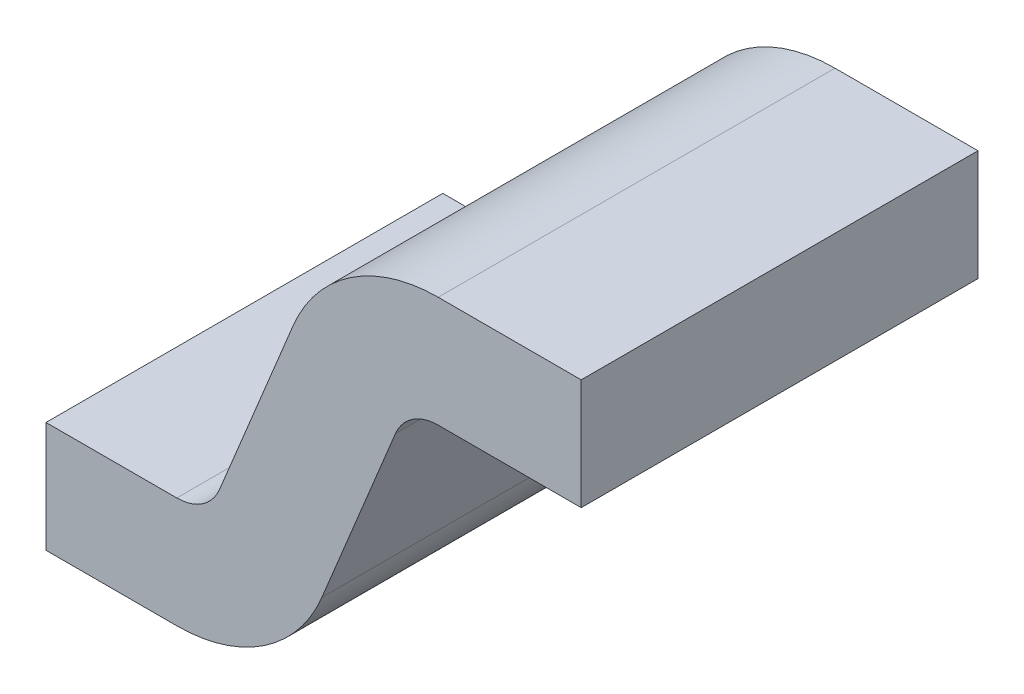
ISO-10303-21;
HEADER;
FILE_DESCRIPTION(('STEP AP214'),'2;1');
FILE_NAME('part.step','',(''),(''),'','','');
FILE_SCHEMA(('AUTOMOTIVE_DESIGN { 1 0 10303 214 1 1 1 1 }'));
ENDSEC;
DATA;
#1=APPLICATION_CONTEXT('core data for automotive mechanical design processes');
#2=APPLICATION_PROTOCOL_DEFINITION('international standard','automotive_design',2000,#1);
#3=PRODUCT_CONTEXT('',#1,'mechanical');
#4=PRODUCT('Part','Part','',(#3));
#5=PRODUCT_RELATED_PRODUCT_CATEGORY('part','',(#4));
#6=PRODUCT_DEFINITION_FORMATION('','',#4);
#7=PRODUCT_DEFINITION_CONTEXT('part definition',#1,'design');
#8=PRODUCT_DEFINITION('design','',#6,#7);
#9=PRODUCT_DEFINITION_SHAPE('','',#8);
#10=(LENGTH_UNIT() NAMED_UNIT(*) SI_UNIT(.MILLI.,.METRE.));
#11=(NAMED_UNIT(*) PLANE_ANGLE_UNIT() SI_UNIT($,.RADIAN.));
#12=(NAMED_UNIT(*) SI_UNIT($,.STERADIAN.) SOLID_ANGLE_UNIT());
#13=UNCERTAINTY_MEASURE_WITH_UNIT(LENGTH_MEASURE(1.E-05),#10,'distance_accuracy_value','');
#14=(GEOMETRIC_REPRESENTATION_CONTEXT(3) GLOBAL_UNCERTAINTY_ASSIGNED_CONTEXT((#13)) GLOBAL_UNIT_ASSIGNED_CONTEXT((#10,
#11,#12)) REPRESENTATION_CONTEXT('',''));
#15=CARTESIAN_POINT('',(0.,0.,0.));
#16=DIRECTION('',(0.,0.,1.));
#17=DIRECTION('',(1.,0.,0.));
#18=AXIS2_PLACEMENT_3D('',#15,#16,#17);
#19=CARTESIAN_POINT('',(-0.155,-0.05,0.));
#20=DIRECTION('',(0.,0.,1.));
#21=DIRECTION('',(1.,0.,0.));
#22=AXIS2_PLACEMENT_3D('',#19,#20,#21);
#23=PLANE('',#22);
#24=DIRECTION('',(0.,1.,0.));
#25=VECTOR('',#24,1.);
#26=CARTESIAN_POINT('',(0.,0.12,0.));
#27=LINE('',#26,#25);
#28=CARTESIAN_POINT('',(0.,0.,0.));
#29=VERTEX_POINT('',#28);
#30=CARTESIAN_POINT('',(0.,0.12,0.));
#31=VERTEX_POINT('',#30);
#32=EDGE_CURVE('E156',#29,#31,#27,.T.);
#33=ORIENTED_EDGE('',*,*,#32,.F.);
#34=DIRECTION('',(1.,0.,0.));
#35=VECTOR('',#34,1.);
#36=CARTESIAN_POINT('',(-0.155,0.,0.));
#37=LINE('',#36,#35);
#38=CARTESIAN_POINT('',(-0.155,0.,0.));
#39=VERTEX_POINT('',#38);
#40=EDGE_CURVE('E24',#39,#29,#37,.T.);
#41=ORIENTED_EDGE('',*,*,#40,.F.);
#42=CARTESIAN_POINT('',(-0.155,-0.05,0.));
#43=DIRECTION('',(0.,0.,-1.));
#44=DIRECTION('',(1.,0.,0.));
#45=AXIS2_PLACEMENT_3D('',#42,#43,#44);
#46=CIRCLE('',#45,0.05);
#47=CARTESIAN_POINT('',(-0.201231129660025,-0.0309557712060072,0.));
#48=VERTEX_POINT('',#47);
#49=EDGE_CURVE('E235',#48,#39,#46,.T.);
#50=ORIENTED_EDGE('',*,*,#49,.F.);
#51=DIRECTION('',(0.380884575879857,0.924622593200502,0.));
#52=VECTOR('',#51,1.);
#53=CARTESIAN_POINT('',(-0.281061946169478,-0.224750377899576,0.));
#54=LINE('',#53,#52);
#55=CARTESIAN_POINT('',(-0.281061946169478,-0.224750377899576,0.));
#56=VERTEX_POINT('',#55);
#57=EDGE_CURVE('E159',#56,#48,#54,.T.);
#58=ORIENTED_EDGE('',*,*,#57,.F.);
#59=CARTESIAN_POINT('',(-0.438247787013563,-0.16,0.));
#60=DIRECTION('',(0.,0.,1.));
#61=DIRECTION('',(1.,0.,0.));
#62=AXIS2_PLACEMENT_3D('',#59,#60,#61);
#63=CIRCLE('',#62,0.17);
#64=CARTESIAN_POINT('',(-0.438247787013563,-0.33,0.));
#65=VERTEX_POINT('',#64);
#66=EDGE_CURVE('E218',#65,#56,#63,.T.);
#67=ORIENTED_EDGE('',*,*,#66,.F.);
#68=DIRECTION('',(1.,0.,0.));
#69=VECTOR('',#68,1.);
#70=CARTESIAN_POINT('',(-0.58,-0.33,0.));
#71=LINE('',#70,#69);
#72=CARTESIAN_POINT('',(-0.58,-0.33,0.));
#73=VERTEX_POINT('',#72);
#74=EDGE_CURVE('E172',#73,#65,#71,.T.);
#75=ORIENTED_EDGE('',*,*,#74,.F.);
#76=DIRECTION('',(0.,-1.,0.));
#77=VECTOR('',#76,1.);
#78=CARTESIAN_POINT('',(-0.58,-0.21,0.));
#79=LINE('',#78,#77);
#80=CARTESIAN_POINT('',(-0.58,-0.21,0.));
#81=VERTEX_POINT('',#80);
#82=EDGE_CURVE('E217',#81,#73,#79,.T.);
#83=ORIENTED_EDGE('',*,*,#82,.F.);
#84=DIRECTION('',(-1.,0.,0.));
#85=VECTOR('',#84,1.);
#86=CARTESIAN_POINT('',(-0.438247787013563,-0.21,0.));
#87=LINE('',#86,#85);
#88=CARTESIAN_POINT('',(-0.438247787013563,-0.21,0.));
#89=VERTEX_POINT('',#88);
#90=EDGE_CURVE('E206',#89,#81,#87,.T.);
#91=ORIENTED_EDGE('',*,*,#90,.F.);
#92=CARTESIAN_POINT('',(-0.438247787013563,-0.16,0.));
#93=DIRECTION('',(0.,0.,-1.));
#94=DIRECTION('',(1.,0.,0.));
#95=AXIS2_PLACEMENT_3D('',#92,#93,#94);
#96=CIRCLE('',#95,0.05);
#97=CARTESIAN_POINT('',(-0.392016657353538,-0.179044228793993,0.));
#98=VERTEX_POINT('',#97);
#99=EDGE_CURVE('E197',#98,#89,#96,.T.);
#100=ORIENTED_EDGE('',*,*,#99,.F.);
#101=DIRECTION('',(-0.380884575879857,-0.924622593200502,0.));
#102=VECTOR('',#101,1.);
#103=CARTESIAN_POINT('',(-0.312185840844085,0.0147503778995758,0.));
#104=LINE('',#103,#102);
#105=CARTESIAN_POINT('',(-0.312185840844085,0.0147503778995758,0.));
#106=VERTEX_POINT('',#105);
#107=EDGE_CURVE('E165',#106,#98,#104,.T.);
#108=ORIENTED_EDGE('',*,*,#107,.F.);
#109=CARTESIAN_POINT('',(-0.155,-0.05,0.));
#110=DIRECTION('',(0.,0.,1.));
#111=DIRECTION('',(1.,0.,0.));
#112=AXIS2_PLACEMENT_3D('',#109,#110,#111);
#113=CIRCLE('',#112,0.17);
#114=CARTESIAN_POINT('',(-0.155,0.12,0.));
#115=VERTEX_POINT('',#114);
#116=EDGE_CURVE('E181',#115,#106,#113,.T.);
#117=ORIENTED_EDGE('',*,*,#116,.F.);
#118=DIRECTION('',(-1.,0.,0.));
#119=VECTOR('',#118,1.);
#120=CARTESIAN_POINT('',(0.,0.12,0.));
#121=LINE('',#120,#119);
#122=EDGE_CURVE('E144',#31,#115,#121,.T.);
#123=ORIENTED_EDGE('',*,*,#122,.F.);
#124=EDGE_LOOP('',(#33,#41,#50,#58,#67,#75,#83,#91,#100,#108,#117,#123));
#125=FACE_BOUND('',#124,.T.);
#126=ADVANCED_FACE('F16',(#125),#23,.F.);
#127=CARTESIAN_POINT('',(-0.155,-0.05,0.43));
#128=DIRECTION('',(0.,0.,1.));
#129=DIRECTION('',(1.,0.,0.));
#130=AXIS2_PLACEMENT_3D('',#127,#128,#129);
#131=PLANE('',#130);
#132=DIRECTION('',(0.,1.,0.));
#133=VECTOR('',#132,1.);
#134=CARTESIAN_POINT('',(0.,0.12,0.43));
#135=LINE('',#134,#133);
#136=CARTESIAN_POINT('',(0.,0.,0.43));
#137=VERTEX_POINT('',#136);
#138=CARTESIAN_POINT('',(0.,0.12,0.43));
#139=VERTEX_POINT('',#138);
#140=EDGE_CURVE('E133',#137,#139,#135,.T.);
#141=ORIENTED_EDGE('',*,*,#140,.T.);
#142=DIRECTION('',(-1.,0.,0.));
#143=VECTOR('',#142,1.);
#144=CARTESIAN_POINT('',(0.,0.12,0.43));
#145=LINE('',#144,#143);
#146=CARTESIAN_POINT('',(-0.155,0.12,0.43));
#147=VERTEX_POINT('',#146);
#148=EDGE_CURVE('E185',#139,#147,#145,.T.);
#149=ORIENTED_EDGE('',*,*,#148,.T.);
#150=CARTESIAN_POINT('',(-0.155,-0.05,0.43));
#151=DIRECTION('',(0.,0.,1.));
#152=DIRECTION('',(1.,0.,0.));
#153=AXIS2_PLACEMENT_3D('',#150,#151,#152);
#154=CIRCLE('',#153,0.17);
#155=CARTESIAN_POINT('',(-0.312185840844085,0.0147503778995758,0.43));
#156=VERTEX_POINT('',#155);
#157=EDGE_CURVE('E167',#147,#156,#154,.T.);
#158=ORIENTED_EDGE('',*,*,#157,.T.);
#159=DIRECTION('',(-0.380884575879857,-0.924622593200502,0.));
#160=VECTOR('',#159,1.);
#161=CARTESIAN_POINT('',(-0.312185840844085,0.0147503778995758,0.43));
#162=LINE('',#161,#160);
#163=CARTESIAN_POINT('',(-0.392016657353538,-0.179044228793993,0.43));
#164=VERTEX_POINT('',#163);
#165=EDGE_CURVE('E193',#156,#164,#162,.T.);
#166=ORIENTED_EDGE('',*,*,#165,.T.);
#167=CARTESIAN_POINT('',(-0.438247787013563,-0.16,0.43));
#168=DIRECTION('',(0.,0.,-1.));
#169=DIRECTION('',(1.,0.,0.));
#170=AXIS2_PLACEMENT_3D('',#167,#168,#169);
#171=CIRCLE('',#170,0.05);
#172=CARTESIAN_POINT('',(-0.438247787013563,-0.21,0.43));
#173=VERTEX_POINT('',#172);
#174=EDGE_CURVE('E202',#164,#173,#171,.T.);
#175=ORIENTED_EDGE('',*,*,#174,.T.);
#176=DIRECTION('',(-1.,0.,0.));
#177=VECTOR('',#176,1.);
#178=CARTESIAN_POINT('',(-0.438247787013563,-0.21,0.43));
#179=LINE('',#178,#177);
#180=CARTESIAN_POINT('',(-0.58,-0.21,0.43));
#181=VERTEX_POINT('',#180);
#182=EDGE_CURVE('E212',#173,#181,#179,.T.);
#183=ORIENTED_EDGE('',*,*,#182,.T.);
#184=DIRECTION('',(0.,-1.,0.));
#185=VECTOR('',#184,1.);
#186=CARTESIAN_POINT('',(-0.58,-0.21,0.43));
#187=LINE('',#186,#185);
#188=CARTESIAN_POINT('',(-0.58,-0.33,0.43));
#189=VERTEX_POINT('',#188);
#190=EDGE_CURVE('E180',#181,#189,#187,.T.);
#191=ORIENTED_EDGE('',*,*,#190,.T.);
#192=DIRECTION('',(1.,0.,0.));
#193=VECTOR('',#192,1.);
#194=CARTESIAN_POINT('',(-0.58,-0.33,0.43));
#195=LINE('',#194,#193);
#196=CARTESIAN_POINT('',(-0.438247787013563,-0.33,0.43));
#197=VERTEX_POINT('',#196);
#198=EDGE_CURVE('E221',#189,#197,#195,.T.);
#199=ORIENTED_EDGE('',*,*,#198,.T.);
#200=CARTESIAN_POINT('',(-0.438247787013563,-0.16,0.43));
#201=DIRECTION('',(0.,0.,1.));
#202=DIRECTION('',(1.,0.,0.));
#203=AXIS2_PLACEMENT_3D('',#200,#201,#202);
#204=CIRCLE('',#203,0.17);
#205=CARTESIAN_POINT('',(-0.281061946169478,-0.224750377899576,0.43));
#206=VERTEX_POINT('',#205);
#207=EDGE_CURVE('E249',#197,#206,#204,.T.);
#208=ORIENTED_EDGE('',*,*,#207,.T.);
#209=DIRECTION('',(0.380884575879857,0.924622593200502,0.));
#210=VECTOR('',#209,1.);
#211=CARTESIAN_POINT('',(-0.281061946169478,-0.224750377899576,0.43));
#212=LINE('',#211,#210);
#213=CARTESIAN_POINT('',(-0.201231129660025,-0.0309557712060072,0.43));
#214=VERTEX_POINT('',#213);
#215=EDGE_CURVE('E236',#206,#214,#212,.T.);
#216=ORIENTED_EDGE('',*,*,#215,.T.);
#217=CARTESIAN_POINT('',(-0.155,-0.05,0.43));
#218=DIRECTION('',(0.,0.,-1.));
#219=DIRECTION('',(1.,0.,0.));
#220=AXIS2_PLACEMENT_3D('',#217,#218,#219);
#221=CIRCLE('',#220,0.05);
#222=CARTESIAN_POINT('',(-0.155,0.,0.43));
#223=VERTEX_POINT('',#222);
#224=EDGE_CURVE('E140',#214,#223,#221,.T.);
#225=ORIENTED_EDGE('',*,*,#224,.T.);
#226=DIRECTION('',(1.,0.,0.));
#227=VECTOR('',#226,1.);
#228=CARTESIAN_POINT('',(-0.155,0.,0.43));
#229=LINE('',#228,#227);
#230=EDGE_CURVE('E11',#223,#137,#229,.T.);
#231=ORIENTED_EDGE('',*,*,#230,.T.);
#232=EDGE_LOOP('',(#141,#149,#158,#166,#175,#183,#191,#199,#208,#216,#225,#231));
#233=FACE_BOUND('',#232,.T.);
#234=ADVANCED_FACE('F131',(#233),#131,.T.);
#235=CARTESIAN_POINT('',(-0.155,0.,0.43));
#236=DIRECTION('',(0.,1.,0.));
#237=DIRECTION('',(1.,0.,0.));
#238=AXIS2_PLACEMENT_3D('',#235,#236,#237);
#239=PLANE('',#238);
#240=ORIENTED_EDGE('',*,*,#40,.T.);
#241=DIRECTION('',(0.,0.,-1.));
#242=VECTOR('',#241,1.);
#243=CARTESIAN_POINT('',(0.,0.,0.43));
#244=LINE('',#243,#242);
#245=EDGE_CURVE('E139',#137,#29,#244,.T.);
#246=ORIENTED_EDGE('',*,*,#245,.F.);
#247=ORIENTED_EDGE('',*,*,#230,.F.);
#248=DIRECTION('',(0.,0.,-1.));
#249=VECTOR('',#248,1.);
#250=CARTESIAN_POINT('',(-0.155,0.,0.43));
#251=LINE('',#250,#249);
#252=EDGE_CURVE('E240',#223,#39,#251,.T.);
#253=ORIENTED_EDGE('',*,*,#252,.T.);
#254=EDGE_LOOP('',(#240,#246,#247,#253));
#255=FACE_BOUND('',#254,.T.);
#256=ADVANCED_FACE('F143',(#255),#239,.F.);
#257=CARTESIAN_POINT('',(-0.155,-0.05,0.43));
#258=DIRECTION('',(0.,0.,-1.));
#259=DIRECTION('',(-1.,0.,0.));
#260=AXIS2_PLACEMENT_3D('',#257,#258,#259);
#261=CYLINDRICAL_SURFACE('',#260,0.05);
#262=ORIENTED_EDGE('',*,*,#49,.T.);
#263=ORIENTED_EDGE('',*,*,#252,.F.);
#264=ORIENTED_EDGE('',*,*,#224,.F.);
#265=DIRECTION('',(0.,0.,-1.));
#266=VECTOR('',#265,1.);
#267=CARTESIAN_POINT('',(-0.201231129660025,-0.0309557712060072,0.43));
#268=LINE('',#267,#266);
#269=EDGE_CURVE('E255',#214,#48,#268,.T.);
#270=ORIENTED_EDGE('',*,*,#269,.T.);
#271=EDGE_LOOP('',(#262,#263,#264,#270));
#272=FACE_BOUND('',#271,.T.);
#273=ADVANCED_FACE('F407',(#272),#261,.F.);
#274=CARTESIAN_POINT('',(-0.281061946169478,-0.224750377899576,0.43));
#275=DIRECTION('',(-0.924622593200502,0.380884575879857,0.));
#276=DIRECTION('',(0.,0.,1.));
#277=AXIS2_PLACEMENT_3D('',#274,#275,#276);
#278=PLANE('',#277);
#279=ORIENTED_EDGE('',*,*,#57,.T.);
#280=ORIENTED_EDGE('',*,*,#269,.F.);
#281=ORIENTED_EDGE('',*,*,#215,.F.);
#282=DIRECTION('',(0.,0.,-1.));
#283=VECTOR('',#282,1.);
#284=CARTESIAN_POINT('',(-0.281061946169478,-0.224750377899576,0.43));
#285=LINE('',#284,#283);
#286=EDGE_CURVE('E224',#206,#56,#285,.T.);
#287=ORIENTED_EDGE('',*,*,#286,.T.);
#288=EDGE_LOOP('',(#279,#280,#281,#287));
#289=FACE_BOUND('',#288,.T.);
#290=ADVANCED_FACE('F406',(#289),#278,.F.);
#291=CARTESIAN_POINT('',(-0.438247787013563,-0.16,0.43));
#292=DIRECTION('',(0.,0.,-1.));
#293=DIRECTION('',(-1.,0.,0.));
#294=AXIS2_PLACEMENT_3D('',#291,#292,#293);
#295=CYLINDRICAL_SURFACE('',#294,0.17);
#296=ORIENTED_EDGE('',*,*,#66,.T.);
#297=ORIENTED_EDGE('',*,*,#286,.F.);
#298=ORIENTED_EDGE('',*,*,#207,.F.);
#299=DIRECTION('',(0.,0.,-1.));
#300=VECTOR('',#299,1.);
#301=CARTESIAN_POINT('',(-0.438247787013563,-0.33,0.43));
#302=LINE('',#301,#300);
#303=EDGE_CURVE('E176',#197,#65,#302,.T.);
#304=ORIENTED_EDGE('',*,*,#303,.T.);
#305=EDGE_LOOP('',(#296,#297,#298,#304));
#306=FACE_BOUND('',#305,.T.);
#307=ADVANCED_FACE('F401',(#306),#295,.T.);
#308=CARTESIAN_POINT('',(-0.58,-0.33,0.43));
#309=DIRECTION('',(0.,1.,0.));
#310=DIRECTION('',(1.,0.,0.));
#311=AXIS2_PLACEMENT_3D('',#308,#309,#310);
#312=PLANE('',#311);
#313=ORIENTED_EDGE('',*,*,#74,.T.);
#314=ORIENTED_EDGE('',*,*,#303,.F.);
#315=ORIENTED_EDGE('',*,*,#198,.F.);
#316=DIRECTION('',(0.,0.,-1.));
#317=VECTOR('',#316,1.);
#318=CARTESIAN_POINT('',(-0.58,-0.33,0.43));
#319=LINE('',#318,#317);
#320=EDGE_CURVE('E229',#189,#73,#319,.T.);
#321=ORIENTED_EDGE('',*,*,#320,.T.);
#322=EDGE_LOOP('',(#313,#314,#315,#321));
#323=FACE_BOUND('',#322,.T.);
#324=ADVANCED_FACE('F399',(#323),#312,.F.);
#325=CARTESIAN_POINT('',(-0.58,-0.21,0.43));
#326=DIRECTION('',(1.,0.,0.));
#327=DIRECTION('',(0.,1.,0.));
#328=AXIS2_PLACEMENT_3D('',#325,#326,#327);
#329=PLANE('',#328);
#330=ORIENTED_EDGE('',*,*,#82,.T.);
#331=ORIENTED_EDGE('',*,*,#320,.F.);
#332=ORIENTED_EDGE('',*,*,#190,.F.);
#333=DIRECTION('',(0.,0.,-1.));
#334=VECTOR('',#333,1.);
#335=CARTESIAN_POINT('',(-0.58,-0.21,0.43));
#336=LINE('',#335,#334);
#337=EDGE_CURVE('E209',#181,#81,#336,.T.);
#338=ORIENTED_EDGE('',*,*,#337,.T.);
#339=EDGE_LOOP('',(#330,#331,#332,#338));
#340=FACE_BOUND('',#339,.T.);
#341=ADVANCED_FACE('F398',(#340),#329,.F.);
#342=CARTESIAN_POINT('',(-0.438247787013563,-0.21,0.43));
#343=DIRECTION('',(0.,-1.,0.));
#344=DIRECTION('',(0.,0.,-1.));
#345=AXIS2_PLACEMENT_3D('',#342,#343,#344);
#346=PLANE('',#345);
#347=ORIENTED_EDGE('',*,*,#90,.T.);
#348=ORIENTED_EDGE('',*,*,#337,.F.);
#349=ORIENTED_EDGE('',*,*,#182,.F.);
#350=DIRECTION('',(0.,0.,-1.));
#351=VECTOR('',#350,1.);
#352=CARTESIAN_POINT('',(-0.438247787013563,-0.21,0.43));
#353=LINE('',#352,#351);
#354=EDGE_CURVE('E203',#173,#89,#353,.T.);
#355=ORIENTED_EDGE('',*,*,#354,.T.);
#356=EDGE_LOOP('',(#347,#348,#349,#355));
#357=FACE_BOUND('',#356,.T.);
#358=ADVANCED_FACE('F394',(#357),#346,.F.);
#359=CARTESIAN_POINT('',(-0.438247787013563,-0.16,0.43));
#360=DIRECTION('',(0.,0.,-1.));
#361=DIRECTION('',(-1.,0.,0.));
#362=AXIS2_PLACEMENT_3D('',#359,#360,#361);
#363=CYLINDRICAL_SURFACE('',#362,0.05);
#364=ORIENTED_EDGE('',*,*,#99,.T.);
#365=ORIENTED_EDGE('',*,*,#354,.F.);
#366=ORIENTED_EDGE('',*,*,#174,.F.);
#367=DIRECTION('',(0.,0.,-1.));
#368=VECTOR('',#367,1.);
#369=CARTESIAN_POINT('',(-0.392016657353538,-0.179044228793993,0.43));
#370=LINE('',#369,#368);
#371=EDGE_CURVE('E164',#164,#98,#370,.T.);
#372=ORIENTED_EDGE('',*,*,#371,.T.);
#373=EDGE_LOOP('',(#364,#365,#366,#372));
#374=FACE_BOUND('',#373,.T.);
#375=ADVANCED_FACE('F391',(#374),#363,.F.);
#376=CARTESIAN_POINT('',(-0.312185840844085,0.0147503778995758,0.43));
#377=DIRECTION('',(0.924622593200502,-0.380884575879857,0.));
#378=DIRECTION('',(0.,0.,-1.));
#379=AXIS2_PLACEMENT_3D('',#376,#377,#378);
#380=PLANE('',#379);
#381=ORIENTED_EDGE('',*,*,#107,.T.);
#382=ORIENTED_EDGE('',*,*,#371,.F.);
#383=ORIENTED_EDGE('',*,*,#165,.F.);
#384=DIRECTION('',(0.,0.,-1.));
#385=VECTOR('',#384,1.);
#386=CARTESIAN_POINT('',(-0.312185840844085,0.0147503778995758,0.43));
#387=LINE('',#386,#385);
#388=EDGE_CURVE('E186',#156,#106,#387,.T.);
#389=ORIENTED_EDGE('',*,*,#388,.T.);
#390=EDGE_LOOP('',(#381,#382,#383,#389));
#391=FACE_BOUND('',#390,.T.);
#392=ADVANCED_FACE('F386',(#391),#380,.F.);
#393=CARTESIAN_POINT('',(-0.155,-0.05,0.43));
#394=DIRECTION('',(0.,0.,-1.));
#395=DIRECTION('',(-1.,0.,0.));
#396=AXIS2_PLACEMENT_3D('',#393,#394,#395);
#397=CYLINDRICAL_SURFACE('',#396,0.17);
#398=ORIENTED_EDGE('',*,*,#116,.T.);
#399=ORIENTED_EDGE('',*,*,#388,.F.);
#400=ORIENTED_EDGE('',*,*,#157,.F.);
#401=DIRECTION('',(0.,0.,-1.));
#402=VECTOR('',#401,1.);
#403=CARTESIAN_POINT('',(-0.155,0.12,0.43));
#404=LINE('',#403,#402);
#405=EDGE_CURVE('E171',#147,#115,#404,.T.);
#406=ORIENTED_EDGE('',*,*,#405,.T.);
#407=EDGE_LOOP('',(#398,#399,#400,#406));
#408=FACE_BOUND('',#407,.T.);
#409=ADVANCED_FACE('F383',(#408),#397,.T.);
#410=CARTESIAN_POINT('',(0.,0.12,0.43));
#411=DIRECTION('',(0.,-1.,0.));
#412=DIRECTION('',(0.,0.,-1.));
#413=AXIS2_PLACEMENT_3D('',#410,#411,#412);
#414=PLANE('',#413);
#415=ORIENTED_EDGE('',*,*,#122,.T.);
#416=ORIENTED_EDGE('',*,*,#405,.F.);
#417=ORIENTED_EDGE('',*,*,#148,.F.);
#418=DIRECTION('',(0.,0.,-1.));
#419=VECTOR('',#418,1.);
#420=CARTESIAN_POINT('',(0.,0.12,0.43));
#421=LINE('',#420,#419);
#422=EDGE_CURVE('E149',#139,#31,#421,.T.);
#423=ORIENTED_EDGE('',*,*,#422,.T.);
#424=EDGE_LOOP('',(#415,#416,#417,#423));
#425=FACE_BOUND('',#424,.T.);
#426=ADVANCED_FACE('F385',(#425),#414,.F.);
#427=CARTESIAN_POINT('',(0.,0.12,0.43));
#428=DIRECTION('',(-1.,0.,0.));
#429=DIRECTION('',(0.,0.,1.));
#430=AXIS2_PLACEMENT_3D('',#427,#428,#429);
#431=PLANE('',#430);
#432=ORIENTED_EDGE('',*,*,#32,.T.);
#433=ORIENTED_EDGE('',*,*,#422,.F.);
#434=ORIENTED_EDGE('',*,*,#140,.F.);
#435=ORIENTED_EDGE('',*,*,#245,.T.);
#436=EDGE_LOOP('',(#432,#433,#434,#435));
#437=FACE_BOUND('',#436,.T.);
#438=ADVANCED_FACE('F150',(#437),#431,.F.);
#439=CLOSED_SHELL('',(#126,#234,#256,#273,#290,#307,#324,#341,#358,#375,#392,#409,#426,#438));
#440=MANIFOLD_SOLID_BREP('B1',#439);
#441=ADVANCED_BREP_SHAPE_REPRESENTATION('',(#18,#440),#14);
#442=SHAPE_DEFINITION_REPRESENTATION(#9,#441);
ENDSEC;
END-ISO-10303-21;
